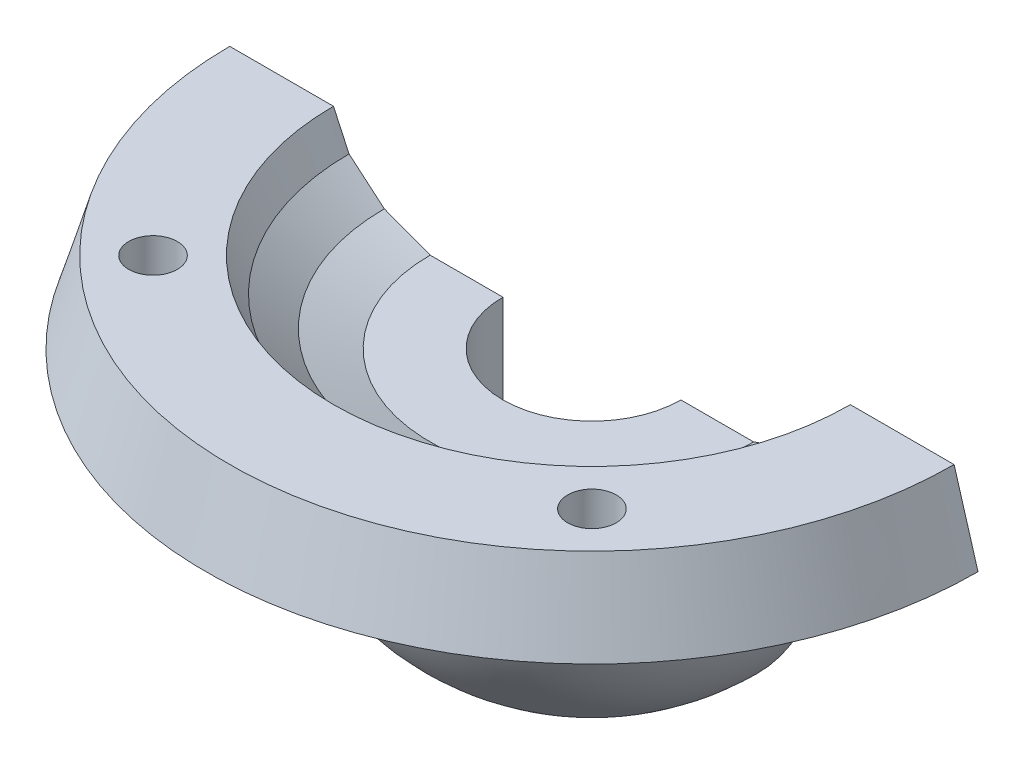
ISO-10303-21;
HEADER;
FILE_DESCRIPTION(('STEP AP214'),'2;1');
FILE_NAME('part.step','',(''),(''),'','','');
FILE_SCHEMA(('AUTOMOTIVE_DESIGN { 1 0 10303 214 1 1 1 1 }'));
ENDSEC;
DATA;
#1=APPLICATION_CONTEXT('core data for automotive mechanical design processes');
#2=APPLICATION_PROTOCOL_DEFINITION('international standard','automotive_design',2000,#1);
#3=PRODUCT_CONTEXT('',#1,'mechanical');
#4=PRODUCT('Part','Part','',(#3));
#5=PRODUCT_RELATED_PRODUCT_CATEGORY('part','',(#4));
#6=PRODUCT_DEFINITION_FORMATION('','',#4);
#7=PRODUCT_DEFINITION_CONTEXT('part definition',#1,'design');
#8=PRODUCT_DEFINITION('design','',#6,#7);
#9=PRODUCT_DEFINITION_SHAPE('','',#8);
#10=(LENGTH_UNIT() NAMED_UNIT(*) SI_UNIT(.MILLI.,.METRE.));
#11=(NAMED_UNIT(*) PLANE_ANGLE_UNIT() SI_UNIT($,.RADIAN.));
#12=(NAMED_UNIT(*) SI_UNIT($,.STERADIAN.) SOLID_ANGLE_UNIT());
#13=UNCERTAINTY_MEASURE_WITH_UNIT(LENGTH_MEASURE(1.E-05),#10,'distance_accuracy_value','');
#14=(GEOMETRIC_REPRESENTATION_CONTEXT(3) GLOBAL_UNCERTAINTY_ASSIGNED_CONTEXT((#13)) GLOBAL_UNIT_ASSIGNED_CONTEXT((#10,
#11,#12)) REPRESENTATION_CONTEXT('',''));
#15=CARTESIAN_POINT('',(0.,0.,0.));
#16=DIRECTION('',(0.,0.,1.));
#17=DIRECTION('',(1.,0.,0.));
#18=AXIS2_PLACEMENT_3D('',#15,#16,#17);
#19=CARTESIAN_POINT('',(0.,-9.5,0.));
#20=DIRECTION('',(0.,1.,0.));
#21=DIRECTION('',(0.,0.,1.));
#22=AXIS2_PLACEMENT_3D('',#19,#20,#21);
#23=PLANE('',#22);
#24=CARTESIAN_POINT('',(0.,-9.5,0.));
#25=DIRECTION('',(0.,-1.,0.));
#26=DIRECTION('',(0.,0.,-1.));
#27=AXIS2_PLACEMENT_3D('',#24,#25,#26);
#28=CIRCLE('',#27,5.99955163034436);
#29=CARTESIAN_POINT('',(5.99955163034436,-9.5,0.));
#30=VERTEX_POINT('',#29);
#31=CARTESIAN_POINT('',(-5.99955163034436,-9.5,0.));
#32=VERTEX_POINT('',#31);
#33=EDGE_CURVE('E11',#30,#32,#28,.T.);
#34=ORIENTED_EDGE('',*,*,#33,.F.);
#35=DIRECTION('',(-1.,0.,0.));
#36=VECTOR('',#35,1.);
#37=CARTESIAN_POINT('',(0.,-9.5,0.));
#38=LINE('',#37,#36);
#39=EDGE_CURVE('E139',#30,#32,#38,.T.);
#40=ORIENTED_EDGE('',*,*,#39,.T.);
#41=EDGE_LOOP('',(#34,#40));
#42=FACE_BOUND('',#41,.T.);
#43=ADVANCED_FACE('F38',(#42),#23,.T.);
#44=CARTESIAN_POINT('',(5.99955163034436,-9.5,0.));
#45=CARTESIAN_POINT('',(6.61396605099555,-9.50002295809842,0.));
#46=CARTESIAN_POINT('',(7.20055343449259,-9.40775932660933,0.));
#47=CARTESIAN_POINT('',(7.83449094822805,-9.30804804948347,0.));
#48=CARTESIAN_POINT('',(8.37066915625013,-9.11079463772736,0.));
#49=CARTESIAN_POINT('',(9.01466001508749,-8.87387826898122,0.));
#50=CARTESIAN_POINT('',(9.42752153762116,-8.53074359866554,0.));
#51=CARTESIAN_POINT('',(9.68430444976027,-8.3173279251515,0.));
#52=CARTESIAN_POINT('',(9.82887241044762,-8.07811753332886,0.));
#53=CARTESIAN_POINT('',(9.99961531347533,-7.79559658926905,0.));
#54=CARTESIAN_POINT('',(9.99962635868416,-7.49999999999999,0.));
#55=B_SPLINE_CURVE_WITH_KNOTS('',2,(#44,#45,#46,#47,#48,#49,#50,#51,#52,#53,#54),.UNSPECIFIED.,
.F.,.F.,(3,2,2,2,2,3),(0.,0.25,0.5,0.75,0.875,1.),.UNSPECIFIED.);
#56=CARTESIAN_POINT('',(0.,-9.5,0.));
#57=DIRECTION('',(0.,-1.,0.));
#58=AXIS1_PLACEMENT('',#56,#57);
#59=SURFACE_OF_REVOLUTION('',#55,#58);
#60=CARTESIAN_POINT('',(0.,-7.5,0.));
#61=DIRECTION('',(0.,-1.,0.));
#62=DIRECTION('',(0.,0.,-1.));
#63=AXIS2_PLACEMENT_3D('',#60,#61,#62);
#64=CIRCLE('',#63,9.99962635868417);
#65=CARTESIAN_POINT('',(9.99962635868417,-7.5,0.));
#66=VERTEX_POINT('',#65);
#67=CARTESIAN_POINT('',(-9.99962635868417,-7.5,0.));
#68=VERTEX_POINT('',#67);
#69=EDGE_CURVE('E49',#66,#68,#64,.T.);
#70=ORIENTED_EDGE('',*,*,#69,.F.);
#71=CARTESIAN_POINT('',(9.99962635868416,-7.49999999999999,0.));
#72=CARTESIAN_POINT('',(9.99962839050835,-7.51967387465813,0.));
#73=CARTESIAN_POINT('',(9.99905777349451,-7.53934778284173,0.));
#74=CARTESIAN_POINT('',(9.99677710958206,-7.57860832192264,0.));
#75=CARTESIAN_POINT('',(9.99506828266646,-7.59819502368751,0.));
#76=CARTESIAN_POINT('',(9.99051181509322,-7.63728110116592,0.));
#77=CARTESIAN_POINT('',(9.98766156375719,-7.65678017234582,0.));
#78=CARTESIAN_POINT('',(9.98082695912954,-7.69569146269355,0.));
#79=CARTESIAN_POINT('',(9.97683630456648,-7.71510257298257,0.));
#80=CARTESIAN_POINT('',(9.96772430714554,-7.75383882368231,0.));
#81=CARTESIAN_POINT('',(9.96259324775312,-7.77316167380568,0.));
#82=CARTESIAN_POINT('',(9.95120382012979,-7.81172265635202,0.));
#83=CARTESIAN_POINT('',(9.94493271640675,-7.83095701874439,0.));
#84=CARTESIAN_POINT('',(9.93126607344495,-7.86934255327232,0.));
#85=CARTESIAN_POINT('',(9.92385525348008,-7.88848827226366,0.));
#86=CARTESIAN_POINT('',(9.90791154012645,-7.9266982341717,0.));
#87=CARTESIAN_POINT('',(9.89936133740584,-7.94575523776493,0.));
#88=CARTESIAN_POINT('',(9.8811408038842,-7.98378953304012,0.));
#89=CARTESIAN_POINT('',(9.87145166070957,-8.00275779040611,0.));
#90=CARTESIAN_POINT('',(9.85095420849574,-8.04061644996868,0.));
#91=CARTESIAN_POINT('',(9.84012607419447,-8.05949609867161,0.));
#92=CARTESIAN_POINT('',(9.8191701233145,-8.09417190548175,0.));
#93=CARTESIAN_POINT('',(9.80915154287965,-8.11003434879421,0.));
#94=CARTESIAN_POINT('',(9.7883745839193,-8.14159257946196,0.));
#95=CARTESIAN_POINT('',(9.77760768781593,-8.15728275746822,0.));
#96=CARTESIAN_POINT('',(9.7553344973771,-8.18849678705557,0.));
#97=CARTESIAN_POINT('',(9.7438193372094,-8.20401430402267,0.));
#98=CARTESIAN_POINT('',(9.72004993594701,-8.23488382602855,0.));
#99=CARTESIAN_POINT('',(9.70778661017508,-8.25022882841588,0.));
#100=CARTESIAN_POINT('',(9.68252103275914,-8.28075393753729,0.));
#101=CARTESIAN_POINT('',(9.66950959309667,-8.29592643088103,0.));
#102=CARTESIAN_POINT('',(9.64274792522381,-8.32610712671582,0.));
#103=CARTESIAN_POINT('',(9.62898850959343,-8.3411071726134,0.));
#104=CARTESIAN_POINT('',(9.60073058007547,-8.37094345921676,0.));
#105=CARTESIAN_POINT('',(9.58622296053328,-8.38577106981389,0.));
#106=CARTESIAN_POINT('',(9.55646956765986,-8.41526306066591,0.));
#107=CARTESIAN_POINT('',(9.54121487005573,-8.42991841243425,0.));
#108=CARTESIAN_POINT('',(9.49385555378069,-8.47408864154925,0.));
#109=CARTESIAN_POINT('',(9.46105516417141,-8.5028617388254,0.));
#110=CARTESIAN_POINT('',(9.39971072450335,-8.55386716963479,0.));
#111=CARTESIAN_POINT('',(9.37139558619255,-8.57637774163087,0.));
#112=CARTESIAN_POINT('',(9.31324763249988,-8.620721425521,0.));
#113=CARTESIAN_POINT('',(9.28339513281944,-8.64252873860582,0.));
#114=CARTESIAN_POINT('',(9.22216832012768,-8.68545959524664,0.));
#115=CARTESIAN_POINT('',(9.19077477826441,-8.70655565270858,0.));
#116=CARTESIAN_POINT('',(9.12646628712565,-8.74806760895407,0.));
#117=CARTESIAN_POINT('',(9.0935329058413,-8.76845490571997,0.));
#118=CARTESIAN_POINT('',(9.02614358273149,-8.80854981021715,0.));
#119=CARTESIAN_POINT('',(8.99167014143273,-8.82822795214073,0.));
#120=CARTESIAN_POINT('',(8.92119982965636,-8.86690537929476,0.));
#121=CARTESIAN_POINT('',(8.88518651592739,-8.88587464576851,0.));
#122=CARTESIAN_POINT('',(8.81163514638845,-8.92313510119812,0.));
#123=CARTESIAN_POINT('',(8.77408176092831,-8.94139598818061,0.));
#124=CARTESIAN_POINT('',(8.69744986528187,-8.97723853643118,0.));
#125=CARTESIAN_POINT('',(8.65835719329048,-8.99478979948911,0.));
#126=CARTESIAN_POINT('',(8.53719948708111,-9.04711770758199,0.));
#127=CARTESIAN_POINT('',(8.45432215869959,-9.0800258898987,0.));
#128=CARTESIAN_POINT('',(8.29842396820683,-9.1373674313827,0.));
#129=CARTESIAN_POINT('',(8.22560023927556,-9.16234451573224,0.));
#130=CARTESIAN_POINT('',(8.07736478596114,-9.20975908515846,0.));
#131=CARTESIAN_POINT('',(8.00193134806801,-9.23212875422472,0.));
#132=CARTESIAN_POINT('',(7.84848066679162,-9.27433609465649,0.));
#133=CARTESIAN_POINT('',(7.77044406297329,-9.29410305147519,0.));
#134=CARTESIAN_POINT('',(7.61178299620726,-9.33110646527565,0.));
#135=CARTESIAN_POINT('',(7.53114160853117,-9.34827010753031,0.));
#136=CARTESIAN_POINT('',(7.36726886028062,-9.38006922907913,0.));
#137=CARTESIAN_POINT('',(7.28402319727737,-9.39463066911813,0.));
#138=CARTESIAN_POINT('',(7.12215455575627,-9.42009040306485,0.));
#139=CARTESIAN_POINT('',(7.04355797879159,-9.4311574953728,0.));
#140=CARTESIAN_POINT('',(6.88562420015101,-9.45084255963852,0.));
#141=CARTESIAN_POINT('',(6.80628529573276,-9.45944687413717,0.));
#142=CARTESIAN_POINT('',(6.64686735412966,-9.47420908433083,0.));
#143=CARTESIAN_POINT('',(6.56678683416007,-9.48035093037252,0.));
#144=CARTESIAN_POINT('',(6.40588553747974,-9.49019013055033,0.));
#145=CARTESIAN_POINT('',(6.32506364692423,-9.49386918069787,0.));
#146=CARTESIAN_POINT('',(6.16267810605128,-9.49878645275539,0.));
#147=CARTESIAN_POINT('',(6.08111383563242,-9.50000429386834,0.));
#148=CARTESIAN_POINT('',(5.99955163034436,-9.5,0.));
#149=B_SPLINE_CURVE_WITH_KNOTS('',3,(#71,#72,#73,#74,#75,#76,#77,#78,#79,#80,#81,#82,#83,#84,
#85,#86,#87,#88,#89,#90,#91,#92,#93,#94,#95,#96,#97,#98,#99,#100,#101,#102,#103,#104,#105,#106,
#107,#108,#109,#110,#111,#112,#113,#114,#115,#116,#117,#118,#119,#120,#121,#122,#123,#124,#125,
#126,#127,#128,#129,#130,#131,#132,#133,#134,#135,#136,#137,#138,#139,#140,#141,#142,#143,#144,
#145,#146,#147,#148),.UNSPECIFIED.,.F.,.F.,(4,2,2,2,2,2,2,2,2,2,2,2,2,2,2,2,2,2,2,2,2,2,2,2,2,2,
2,2,2,2,2,2,2,2,2,2,2,2,4),(0.,0.0590133278245486,0.117963504159202,0.177049289172716,
0.236468082186857,0.296413992870312,0.3570760710073,0.418636768793669,0.481270685897812,
0.545143621508214,0.610411933168543,0.666682665497858,0.723756476858823,0.781713794083774,
0.84063142596777,0.900582490378502,0.961636392394664,1.0238588467747,1.08731193777121,
1.21812741840169,1.32661806671489,1.43749548133101,1.55093773029778,1.66711108829124,
1.78617038798035,1.90825948272514,2.03351178708274,2.16205086641789,2.42941266112328,
2.6603141538193,2.89628633353615,3.13772856917416,3.38501372840924,3.6384888950123,
3.87656515384176,4.11593717100725,4.3568449272456,4.59952384734369,4.84420424364552),.UNSPECIFIED.);
#150=EDGE_CURVE('E144',#30,#66,#149,.F.);
#151=ORIENTED_EDGE('',*,*,#150,.F.);
#152=ORIENTED_EDGE('',*,*,#33,.T.);
#153=CARTESIAN_POINT('',(-5.99955163034436,-9.5,0.));
#154=CARTESIAN_POINT('',(-6.08111383563242,-9.50000429386834,0.));
#155=CARTESIAN_POINT('',(-6.16267810605128,-9.49878645275539,0.));
#156=CARTESIAN_POINT('',(-6.32506364692423,-9.49386918069787,0.));
#157=CARTESIAN_POINT('',(-6.40588553747974,-9.49019013055032,0.));
#158=CARTESIAN_POINT('',(-6.56678683416007,-9.48035093037252,0.));
#159=CARTESIAN_POINT('',(-6.64686735412966,-9.47420908433083,0.));
#160=CARTESIAN_POINT('',(-6.80628529573276,-9.45944687413717,0.));
#161=CARTESIAN_POINT('',(-6.88562420015101,-9.45084255963852,0.));
#162=CARTESIAN_POINT('',(-7.04355797879159,-9.4311574953728,0.));
#163=CARTESIAN_POINT('',(-7.12215455575627,-9.42009040306485,0.));
#164=CARTESIAN_POINT('',(-7.28402319727737,-9.39463066911813,0.));
#165=CARTESIAN_POINT('',(-7.36726886028062,-9.38006922907913,0.));
#166=CARTESIAN_POINT('',(-7.53114160853117,-9.34827010753031,0.));
#167=CARTESIAN_POINT('',(-7.61178299620726,-9.33110646527565,0.));
#168=CARTESIAN_POINT('',(-7.77044406297329,-9.29410305147519,0.));
#169=CARTESIAN_POINT('',(-7.84848066679162,-9.27433609465649,0.));
#170=CARTESIAN_POINT('',(-8.00193134806801,-9.23212875422472,0.));
#171=CARTESIAN_POINT('',(-8.07736478596114,-9.20975908515846,0.));
#172=CARTESIAN_POINT('',(-8.22560023927556,-9.16234451573224,0.));
#173=CARTESIAN_POINT('',(-8.29842396820683,-9.1373674313827,0.));
#174=CARTESIAN_POINT('',(-8.45432215869959,-9.0800258898987,0.));
#175=CARTESIAN_POINT('',(-8.53719948708111,-9.04711770758199,0.));
#176=CARTESIAN_POINT('',(-8.65835719329048,-8.99478979948911,0.));
#177=CARTESIAN_POINT('',(-8.69744986528187,-8.97723853643118,0.));
#178=CARTESIAN_POINT('',(-8.77408176092831,-8.94139598818061,0.));
#179=CARTESIAN_POINT('',(-8.81163514638845,-8.92313510119812,0.));
#180=CARTESIAN_POINT('',(-8.88518651592739,-8.88587464576851,0.));
#181=CARTESIAN_POINT('',(-8.92119982965636,-8.86690537929476,0.));
#182=CARTESIAN_POINT('',(-8.99167014143273,-8.82822795214073,0.));
#183=CARTESIAN_POINT('',(-9.02614358273149,-8.80854981021715,0.));
#184=CARTESIAN_POINT('',(-9.0935329058413,-8.76845490571997,0.));
#185=CARTESIAN_POINT('',(-9.12646628712565,-8.74806760895407,0.));
#186=CARTESIAN_POINT('',(-9.19077477826441,-8.70655565270858,0.));
#187=CARTESIAN_POINT('',(-9.22216832012768,-8.68545959524664,0.));
#188=CARTESIAN_POINT('',(-9.28339513281944,-8.64252873860582,0.));
#189=CARTESIAN_POINT('',(-9.31324763249988,-8.620721425521,0.));
#190=CARTESIAN_POINT('',(-9.37139558619255,-8.57637774163087,0.));
#191=CARTESIAN_POINT('',(-9.39971072450335,-8.55386716963479,0.));
#192=CARTESIAN_POINT('',(-9.46105516417141,-8.5028617388254,0.));
#193=CARTESIAN_POINT('',(-9.49385555378069,-8.47408864154925,0.));
#194=CARTESIAN_POINT('',(-9.54121487005573,-8.42991841243425,0.));
#195=CARTESIAN_POINT('',(-9.55646956765986,-8.41526306066591,0.));
#196=CARTESIAN_POINT('',(-9.58622296053328,-8.38577106981389,0.));
#197=CARTESIAN_POINT('',(-9.60073058007547,-8.37094345921676,0.));
#198=CARTESIAN_POINT('',(-9.62898850959343,-8.3411071726134,0.));
#199=CARTESIAN_POINT('',(-9.64274792522381,-8.32610712671582,0.));
#200=CARTESIAN_POINT('',(-9.66950959309667,-8.29592643088103,0.));
#201=CARTESIAN_POINT('',(-9.68252103275914,-8.28075393753729,0.));
#202=CARTESIAN_POINT('',(-9.70778661017508,-8.25022882841588,0.));
#203=CARTESIAN_POINT('',(-9.72004993594701,-8.23488382602855,0.));
#204=CARTESIAN_POINT('',(-9.7438193372094,-8.20401430402267,0.));
#205=CARTESIAN_POINT('',(-9.7553344973771,-8.18849678705557,0.));
#206=CARTESIAN_POINT('',(-9.77760768781593,-8.15728275746822,0.));
#207=CARTESIAN_POINT('',(-9.7883745839193,-8.14159257946196,0.));
#208=CARTESIAN_POINT('',(-9.80915154287965,-8.11003434879421,0.));
#209=CARTESIAN_POINT('',(-9.8191701233145,-8.09417190548175,0.));
#210=CARTESIAN_POINT('',(-9.84012607419447,-8.05949609867161,0.));
#211=CARTESIAN_POINT('',(-9.85095420849574,-8.04061644996868,0.));
#212=CARTESIAN_POINT('',(-9.87145166070957,-8.00275779040611,0.));
#213=CARTESIAN_POINT('',(-9.8811408038842,-7.98378953304012,0.));
#214=CARTESIAN_POINT('',(-9.89936133740584,-7.94575523776493,0.));
#215=CARTESIAN_POINT('',(-9.90791154012645,-7.92669823417169,0.));
#216=CARTESIAN_POINT('',(-9.92385525348008,-7.88848827226366,0.));
#217=CARTESIAN_POINT('',(-9.93126607344495,-7.86934255327231,0.));
#218=CARTESIAN_POINT('',(-9.94493271640675,-7.83095701874439,0.));
#219=CARTESIAN_POINT('',(-9.95120382012979,-7.81172265635202,0.));
#220=CARTESIAN_POINT('',(-9.96259324775312,-7.77316167380568,0.));
#221=CARTESIAN_POINT('',(-9.96772430714554,-7.75383882368231,0.));
#222=CARTESIAN_POINT('',(-9.97683630456648,-7.71510257298257,0.));
#223=CARTESIAN_POINT('',(-9.98082695912954,-7.69569146269355,0.));
#224=CARTESIAN_POINT('',(-9.98766156375719,-7.65678017234582,0.));
#225=CARTESIAN_POINT('',(-9.99051181509322,-7.63728110116592,0.));
#226=CARTESIAN_POINT('',(-9.99506828266646,-7.59819502368751,0.));
#227=CARTESIAN_POINT('',(-9.99677710958206,-7.57860832192264,0.));
#228=CARTESIAN_POINT('',(-9.99905777349451,-7.53934778284173,0.));
#229=CARTESIAN_POINT('',(-9.99962839050835,-7.51967387465813,0.));
#230=CARTESIAN_POINT('',(-9.99962635868416,-7.49999999999999,0.));
#231=B_SPLINE_CURVE_WITH_KNOTS('',3,(#153,#154,#155,#156,#157,#158,#159,#160,#161,#162,#163,
#164,#165,#166,#167,#168,#169,#170,#171,#172,#173,#174,#175,#176,#177,#178,#179,#180,#181,#182,
#183,#184,#185,#186,#187,#188,#189,#190,#191,#192,#193,#194,#195,#196,#197,#198,#199,#200,#201,
#202,#203,#204,#205,#206,#207,#208,#209,#210,#211,#212,#213,#214,#215,#216,#217,#218,#219,#220,
#221,#222,#223,#224,#225,#226,#227,#228,#229,#230),.UNSPECIFIED.,.F.,.F.,(4,2,2,2,2,2,2,2,2,2,2,
2,2,2,2,2,2,2,2,2,2,2,2,2,2,2,2,2,2,2,2,2,2,2,2,2,2,2,4),(0.,0.244680396301831,0.48735931639992,
0.728267072638264,0.967639089803761,1.20571534863321,1.45919051523628,1.70647567447136,
1.94791791010937,2.18389008982621,2.41479158252224,2.68215337722762,2.81069245656278,
2.93594476092038,3.05803385566516,3.17709315535428,3.29326651334774,3.40670876231451,
3.51758617693063,3.62607682524383,3.75689230587431,3.82034539687081,3.88256785125085,
3.94362175326702,4.00357281767775,4.06249044956174,4.1204477667867,4.17752157814766,
4.23379231047698,4.29906062213731,4.36293355774771,4.42556747485185,4.48712817263822,
4.54779025077521,4.60773616145866,4.6671549544728,4.72624073948632,4.78519091582097,
4.84420424364552),.UNSPECIFIED.);
#232=EDGE_CURVE('E149',#32,#68,#231,.T.);
#233=ORIENTED_EDGE('',*,*,#232,.T.);
#234=EDGE_LOOP('',(#70,#151,#152,#233));
#235=FACE_BOUND('',#234,.T.);
#236=ADVANCED_FACE('F40',(#235),#59,.T.);
#237=CARTESIAN_POINT('',(0.,-4.20530792283386,0.));
#238=DIRECTION('',(0.,1.,0.));
#239=DIRECTION('',(0.,0.,1.));
#240=AXIS2_PLACEMENT_3D('',#237,#238,#239);
#241=CONICAL_SURFACE('',#240,10.,0.000113407051547982);
#242=CARTESIAN_POINT('',(0.,-4.20530792283386,0.));
#243=DIRECTION('',(0.,-1.,0.));
#244=DIRECTION('',(0.,0.,-1.));
#245=AXIS2_PLACEMENT_3D('',#242,#243,#244);
#246=CIRCLE('',#245,10.);
#247=CARTESIAN_POINT('',(10.,-4.20530792283386,0.));
#248=VERTEX_POINT('',#247);
#249=CARTESIAN_POINT('',(-10.,-4.20530792283386,0.));
#250=VERTEX_POINT('',#249);
#251=EDGE_CURVE('E204',#248,#250,#246,.T.);
#252=ORIENTED_EDGE('',*,*,#251,.F.);
#253=DIRECTION('',(-0.000113407051304891,-0.99999999356942,0.));
#254=VECTOR('',#253,1.);
#255=CARTESIAN_POINT('',(10.0004767829567,-0.00113412459089122,0.));
#256=LINE('',#255,#254);
#257=EDGE_CURVE('E207',#248,#66,#256,.T.);
#258=ORIENTED_EDGE('',*,*,#257,.T.);
#259=ORIENTED_EDGE('',*,*,#69,.T.);
#260=DIRECTION('',(0.000113407051304891,-0.99999999356942,0.));
#261=VECTOR('',#260,1.);
#262=CARTESIAN_POINT('',(-10.0004767829567,-0.00113412459089122,0.));
#263=LINE('',#262,#261);
#264=EDGE_CURVE('E157',#250,#68,#263,.T.);
#265=ORIENTED_EDGE('',*,*,#264,.F.);
#266=EDGE_LOOP('',(#252,#258,#259,#265));
#267=FACE_BOUND('',#266,.T.);
#268=ADVANCED_FACE('F310',(#267),#241,.F.);
#269=CARTESIAN_POINT('',(0.,-3.5,0.));
#270=DIRECTION('',(0.,-1.,0.));
#271=DIRECTION('',(0.,0.,-1.));
#272=AXIS2_PLACEMENT_3D('',#269,#270,#271);
#273=CONICAL_SURFACE('',#272,6.14232061003034,1.38996145466932);
#274=CARTESIAN_POINT('',(0.,-3.5,0.));
#275=DIRECTION('',(0.,-1.,0.));
#276=DIRECTION('',(0.,0.,-1.));
#277=AXIS2_PLACEMENT_3D('',#274,#275,#276);
#278=CIRCLE('',#277,6.14232061003034);
#279=CARTESIAN_POINT('',(6.14232061003034,-3.5,0.));
#280=VERTEX_POINT('',#279);
#281=CARTESIAN_POINT('',(-6.14232061003034,-3.5,0.));
#282=VERTEX_POINT('',#281);
#283=EDGE_CURVE('E304',#280,#282,#278,.T.);
#284=ORIENTED_EDGE('',*,*,#283,.F.);
#285=DIRECTION('',(0.98369388312983,-0.179850894612612,0.));
#286=VECTOR('',#285,1.);
#287=CARTESIAN_POINT('',(-0.420532169960723,-2.30009933584544,0.));
#288=LINE('',#287,#286);
#289=EDGE_CURVE('E210',#280,#248,#288,.T.);
#290=ORIENTED_EDGE('',*,*,#289,.T.);
#291=ORIENTED_EDGE('',*,*,#251,.T.);
#292=DIRECTION('',(-0.98369388312983,-0.179850894612612,0.));
#293=VECTOR('',#292,1.);
#294=CARTESIAN_POINT('',(0.420532169960723,-2.30009933584544,0.));
#295=LINE('',#294,#293);
#296=EDGE_CURVE('E220',#282,#250,#295,.T.);
#297=ORIENTED_EDGE('',*,*,#296,.F.);
#298=EDGE_LOOP('',(#284,#290,#291,#297));
#299=FACE_BOUND('',#298,.T.);
#300=ADVANCED_FACE('F306',(#299),#273,.F.);
#301=CARTESIAN_POINT('',(0.,-3.5,0.));
#302=DIRECTION('',(0.,-1.,0.));
#303=DIRECTION('',(0.,0.,-1.));
#304=AXIS2_PLACEMENT_3D('',#301,#302,#303);
#305=PLANE('',#304);
#306=CARTESIAN_POINT('',(0.,-3.5,0.));
#307=DIRECTION('',(0.,-1.,0.));
#308=DIRECTION('',(0.,0.,-1.));
#309=AXIS2_PLACEMENT_3D('',#306,#307,#308);
#310=CIRCLE('',#309,5.5);
#311=CARTESIAN_POINT('',(5.5,-3.5,0.));
#312=VERTEX_POINT('',#311);
#313=CARTESIAN_POINT('',(-5.5,-3.5,0.));
#314=VERTEX_POINT('',#313);
#315=EDGE_CURVE('E302',#312,#314,#310,.T.);
#316=ORIENTED_EDGE('',*,*,#315,.F.);
#317=DIRECTION('',(1.,0.,0.));
#318=VECTOR('',#317,1.);
#319=CARTESIAN_POINT('',(0.,-3.5,0.));
#320=LINE('',#319,#318);
#321=EDGE_CURVE('E261',#312,#280,#320,.T.);
#322=ORIENTED_EDGE('',*,*,#321,.T.);
#323=ORIENTED_EDGE('',*,*,#283,.T.);
#324=DIRECTION('',(-1.,0.,0.));
#325=VECTOR('',#324,1.);
#326=CARTESIAN_POINT('',(0.,-3.5,0.));
#327=LINE('',#326,#325);
#328=EDGE_CURVE('E221',#314,#282,#327,.T.);
#329=ORIENTED_EDGE('',*,*,#328,.F.);
#330=EDGE_LOOP('',(#316,#322,#323,#329));
#331=FACE_BOUND('',#330,.T.);
#332=ADVANCED_FACE('F314',(#331),#305,.T.);
#333=CARTESIAN_POINT('',(0.,-9.5,0.));
#334=DIRECTION('',(0.,-1.,0.));
#335=DIRECTION('',(0.,0.,-1.));
#336=AXIS2_PLACEMENT_3D('',#333,#334,#335);
#337=CYLINDRICAL_SURFACE('',#336,5.5);
#338=CARTESIAN_POINT('',(0.,2.,0.));
#339=DIRECTION('',(0.,-1.,0.));
#340=DIRECTION('',(0.,0.,-1.));
#341=AXIS2_PLACEMENT_3D('',#338,#339,#340);
#342=CIRCLE('',#341,5.5);
#343=CARTESIAN_POINT('',(5.5,2.,0.));
#344=VERTEX_POINT('',#343);
#345=CARTESIAN_POINT('',(-5.5,2.,0.));
#346=VERTEX_POINT('',#345);
#347=EDGE_CURVE('E300',#344,#346,#342,.T.);
#348=ORIENTED_EDGE('',*,*,#347,.F.);
#349=DIRECTION('',(0.,-1.,0.));
#350=VECTOR('',#349,1.);
#351=CARTESIAN_POINT('',(5.5,0.,0.));
#352=LINE('',#351,#350);
#353=EDGE_CURVE('E264',#344,#312,#352,.T.);
#354=ORIENTED_EDGE('',*,*,#353,.T.);
#355=ORIENTED_EDGE('',*,*,#315,.T.);
#356=DIRECTION('',(0.,-1.,0.));
#357=VECTOR('',#356,1.);
#358=CARTESIAN_POINT('',(-5.5,0.,0.));
#359=LINE('',#358,#357);
#360=EDGE_CURVE('E225',#346,#314,#359,.T.);
#361=ORIENTED_EDGE('',*,*,#360,.F.);
#362=EDGE_LOOP('',(#348,#354,#355,#361));
#363=FACE_BOUND('',#362,.T.);
#364=ADVANCED_FACE('F318',(#363),#337,.F.);
#365=CARTESIAN_POINT('',(0.,2.,0.));
#366=DIRECTION('',(0.,-1.,0.));
#367=DIRECTION('',(0.,0.,-1.));
#368=AXIS2_PLACEMENT_3D('',#365,#366,#367);
#369=PLANE('',#368);
#370=CARTESIAN_POINT('',(0.,2.,0.));
#371=DIRECTION('',(0.,-1.,0.));
#372=DIRECTION('',(0.,0.,-1.));
#373=AXIS2_PLACEMENT_3D('',#370,#371,#372);
#374=CIRCLE('',#373,10.);
#375=CARTESIAN_POINT('',(10.,2.,0.));
#376=VERTEX_POINT('',#375);
#377=CARTESIAN_POINT('',(-10.,2.,0.));
#378=VERTEX_POINT('',#377);
#379=EDGE_CURVE('E298',#376,#378,#374,.T.);
#380=ORIENTED_EDGE('',*,*,#379,.F.);
#381=DIRECTION('',(1.,0.,0.));
#382=VECTOR('',#381,1.);
#383=CARTESIAN_POINT('',(0.,2.,0.));
#384=LINE('',#383,#382);
#385=EDGE_CURVE('E267',#344,#376,#384,.T.);
#386=ORIENTED_EDGE('',*,*,#385,.F.);
#387=ORIENTED_EDGE('',*,*,#347,.T.);
#388=DIRECTION('',(-1.,0.,0.));
#389=VECTOR('',#388,1.);
#390=CARTESIAN_POINT('',(0.,2.,0.));
#391=LINE('',#390,#389);
#392=EDGE_CURVE('E233',#346,#378,#391,.T.);
#393=ORIENTED_EDGE('',*,*,#392,.T.);
#394=EDGE_LOOP('',(#380,#386,#387,#393));
#395=FACE_BOUND('',#394,.T.);
#396=ADVANCED_FACE('F323',(#395),#369,.F.);
#397=CARTESIAN_POINT('',(0.,3.06472146190274,0.));
#398=DIRECTION('',(0.,1.,0.));
#399=DIRECTION('',(0.,0.,1.));
#400=AXIS2_PLACEMENT_3D('',#397,#398,#399);
#401=CONICAL_SURFACE('',#400,12.8318599551805,1.21116714027881);
#402=CARTESIAN_POINT('',(0.,3.06472146190274,0.));
#403=DIRECTION('',(0.,-1.,0.));
#404=DIRECTION('',(0.,0.,-1.));
#405=AXIS2_PLACEMENT_3D('',#402,#403,#404);
#406=CIRCLE('',#405,12.8318599551805);
#407=CARTESIAN_POINT('',(12.8318599551805,3.06472146190274,0.));
#408=VERTEX_POINT('',#407);
#409=CARTESIAN_POINT('',(-12.8318599551805,3.06472146190274,0.));
#410=VERTEX_POINT('',#409);
#411=EDGE_CURVE('E296',#408,#410,#406,.T.);
#412=ORIENTED_EDGE('',*,*,#411,.F.);
#413=DIRECTION('',(-0.936027387366533,-0.351927165901955,0.));
#414=VECTOR('',#413,1.);
#415=CARTESIAN_POINT('',(0.579700369712789,-1.54184011662471,0.));
#416=LINE('',#415,#414);
#417=EDGE_CURVE('E270',#408,#376,#416,.T.);
#418=ORIENTED_EDGE('',*,*,#417,.T.);
#419=ORIENTED_EDGE('',*,*,#379,.T.);
#420=DIRECTION('',(0.936027387366533,-0.351927165901955,0.));
#421=VECTOR('',#420,1.);
#422=CARTESIAN_POINT('',(-0.579700369712789,-1.54184011662471,0.));
#423=LINE('',#422,#421);
#424=EDGE_CURVE('E236',#410,#378,#423,.T.);
#425=ORIENTED_EDGE('',*,*,#424,.F.);
#426=EDGE_LOOP('',(#412,#418,#419,#425));
#427=FACE_BOUND('',#426,.T.);
#428=ADVANCED_FACE('F326',(#427),#401,.F.);
#429=CARTESIAN_POINT('',(0.,4.91321714357226,0.));
#430=DIRECTION('',(0.,1.,0.));
#431=DIRECTION('',(0.,0.,1.));
#432=AXIS2_PLACEMENT_3D('',#429,#430,#431);
#433=CONICAL_SURFACE('',#432,15.0130848595505,0.867780093989139);
#434=CARTESIAN_POINT('',(0.,4.91321714357226,0.));
#435=DIRECTION('',(0.,-1.,0.));
#436=DIRECTION('',(0.,0.,-1.));
#437=AXIS2_PLACEMENT_3D('',#434,#435,#436);
#438=CIRCLE('',#437,15.0130848595505);
#439=CARTESIAN_POINT('',(15.0130848595505,4.91321714357226,-1.04835811251178E-13));
#440=VERTEX_POINT('',#439);
#441=CARTESIAN_POINT('',(-15.0130848595505,4.91321714357226,0.));
#442=VERTEX_POINT('',#441);
#443=EDGE_CURVE('E294',#440,#442,#438,.T.);
#444=ORIENTED_EDGE('',*,*,#443,.F.);
#445=DIRECTION('',(-0.762895600573906,-0.646521695401615,0.));
#446=VECTOR('',#445,1.);
#447=CARTESIAN_POINT('',(3.85198488134727,-4.54534215998979,0.));
#448=LINE('',#447,#446);
#449=EDGE_CURVE('E273',#440,#408,#448,.T.);
#450=ORIENTED_EDGE('',*,*,#449,.T.);
#451=ORIENTED_EDGE('',*,*,#411,.T.);
#452=DIRECTION('',(0.762895600573906,-0.646521695401615,0.));
#453=VECTOR('',#452,1.);
#454=CARTESIAN_POINT('',(-3.85198488134727,-4.54534215998979,0.));
#455=LINE('',#454,#453);
#456=EDGE_CURVE('E239',#442,#410,#455,.T.);
#457=ORIENTED_EDGE('',*,*,#456,.F.);
#458=EDGE_LOOP('',(#444,#450,#451,#457));
#459=FACE_BOUND('',#458,.T.);
#460=ADVANCED_FACE('F330',(#459),#433,.F.);
#461=CARTESIAN_POINT('',(0.,6.98353230704211,0.));
#462=DIRECTION('',(0.,1.,0.));
#463=DIRECTION('',(0.,0.,1.));
#464=AXIS2_PLACEMENT_3D('',#461,#462,#463);
#465=CONICAL_SURFACE('',#464,15.9743026140186,0.434670215149244);
#466=CARTESIAN_POINT('',(0.,6.98353230704211,0.));
#467=DIRECTION('',(0.,-1.,0.));
#468=DIRECTION('',(0.,0.,-1.));
#469=AXIS2_PLACEMENT_3D('',#466,#467,#468);
#470=CIRCLE('',#469,15.9743026140186);
#471=CARTESIAN_POINT('',(15.9743026140186,6.98353230704211,-1.11547958955758E-13));
#472=VERTEX_POINT('',#471);
#473=CARTESIAN_POINT('',(-15.9743026140186,6.98353230704211,0.));
#474=VERTEX_POINT('',#473);
#475=EDGE_CURVE('E292',#472,#474,#470,.T.);
#476=ORIENTED_EDGE('',*,*,#475,.F.);
#477=DIRECTION('',(-0.421111306454629,-0.907008967748432,0.));
#478=VECTOR('',#477,1.);
#479=CARTESIAN_POINT('',(10.4741316785176,-4.86298970788318,0.));
#480=LINE('',#479,#478);
#481=EDGE_CURVE('E276',#472,#440,#480,.T.);
#482=ORIENTED_EDGE('',*,*,#481,.T.);
#483=ORIENTED_EDGE('',*,*,#443,.T.);
#484=DIRECTION('',(0.421111306454629,-0.907008967748432,0.));
#485=VECTOR('',#484,1.);
#486=CARTESIAN_POINT('',(-10.4741316785176,-4.86298970788318,0.));
#487=LINE('',#486,#485);
#488=EDGE_CURVE('E242',#474,#442,#487,.T.);
#489=ORIENTED_EDGE('',*,*,#488,.F.);
#490=EDGE_LOOP('',(#476,#482,#483,#489));
#491=FACE_BOUND('',#490,.T.);
#492=ADVANCED_FACE('F334',(#491),#465,.F.);
#493=CARTESIAN_POINT('',(0.,6.98353230704211,0.));
#494=DIRECTION('',(0.,1.,0.));
#495=DIRECTION('',(0.,0.,1.));
#496=AXIS2_PLACEMENT_3D('',#493,#494,#495);
#497=PLANE('',#496);
#498=CARTESIAN_POINT('',(-13.5647015960109,6.98353230704211,13.5647015960109));
#499=DIRECTION('',(0.,-1.,0.));
#500=DIRECTION('',(0.,0.,1.));
#501=AXIS2_PLACEMENT_3D('',#498,#499,#500);
#502=CIRCLE('',#501,1.5);
#503=CARTESIAN_POINT('',(-13.5647015960109,6.98353230704211,15.0647015960109));
#504=VERTEX_POINT('',#503);
#505=EDGE_CURVE('E429',#504,#504,#502,.T.);
#506=ORIENTED_EDGE('',*,*,#505,.T.);
#507=EDGE_LOOP('',(#506));
#508=FACE_BOUND('',#507,.T.);
#509=CARTESIAN_POINT('',(13.5647015960109,6.98353230704211,13.5647015960109));
#510=DIRECTION('',(0.,1.,0.));
#511=DIRECTION('',(0.,0.,1.));
#512=AXIS2_PLACEMENT_3D('',#509,#510,#511);
#513=CIRCLE('',#512,1.5);
#514=CARTESIAN_POINT('',(13.5647015960109,6.98353230704211,15.0647015960109));
#515=VERTEX_POINT('',#514);
#516=EDGE_CURVE('E228',#515,#515,#513,.T.);
#517=ORIENTED_EDGE('',*,*,#516,.F.);
#518=EDGE_LOOP('',(#517));
#519=FACE_BOUND('',#518,.T.);
#520=CARTESIAN_POINT('',(0.,6.98353230704211,0.));
#521=DIRECTION('',(0.,-1.,0.));
#522=DIRECTION('',(0.,0.,-1.));
#523=AXIS2_PLACEMENT_3D('',#520,#521,#522);
#524=CIRCLE('',#523,22.3878916266319);
#525=CARTESIAN_POINT('',(22.3878916266319,6.98353230704211,-1.56333811660856E-13));
#526=VERTEX_POINT('',#525);
#527=CARTESIAN_POINT('',(-22.3878916266319,6.98353230704211,0.));
#528=VERTEX_POINT('',#527);
#529=EDGE_CURVE('E290',#526,#528,#524,.T.);
#530=ORIENTED_EDGE('',*,*,#529,.F.);
#531=DIRECTION('',(-1.,0.,0.));
#532=VECTOR('',#531,1.);
#533=CARTESIAN_POINT('',(0.,6.98353230704211,0.));
#534=LINE('',#533,#532);
#535=EDGE_CURVE('E279',#526,#472,#534,.T.);
#536=ORIENTED_EDGE('',*,*,#535,.T.);
#537=ORIENTED_EDGE('',*,*,#475,.T.);
#538=DIRECTION('',(1.,0.,0.));
#539=VECTOR('',#538,1.);
#540=CARTESIAN_POINT('',(0.,6.98353230704211,0.));
#541=LINE('',#540,#539);
#542=EDGE_CURVE('E245',#528,#474,#541,.T.);
#543=ORIENTED_EDGE('',*,*,#542,.F.);
#544=EDGE_LOOP('',(#530,#536,#537,#543));
#545=FACE_BOUND('',#544,.T.);
#546=ADVANCED_FACE('F337',(#508,#519,#545),#497,.T.);
#547=CARTESIAN_POINT('',(0.,1.98353230704211,0.));
#548=DIRECTION('',(0.,-1.,0.));
#549=DIRECTION('',(0.,0.,-1.));
#550=AXIS2_PLACEMENT_3D('',#547,#548,#549);
#551=CONICAL_SURFACE('',#550,23.8636903192362,0.287010293332889);
#552=CARTESIAN_POINT('',(0.,1.98353230704211,0.));
#553=DIRECTION('',(0.,-1.,0.));
#554=DIRECTION('',(0.,0.,-1.));
#555=AXIS2_PLACEMENT_3D('',#552,#553,#554);
#556=CIRCLE('',#555,23.8636903192362);
#557=CARTESIAN_POINT('',(23.8636903192362,1.98353230704211,-1.6663925885109E-13));
#558=VERTEX_POINT('',#557);
#559=CARTESIAN_POINT('',(-23.8636903192362,1.98353230704211,0.));
#560=VERTEX_POINT('',#559);
#561=EDGE_CURVE('E65',#558,#560,#556,.T.);
#562=ORIENTED_EDGE('',*,*,#561,.F.);
#563=DIRECTION('',(-0.283086083300354,0.959094504958539,0.));
#564=VECTOR('',#563,1.);
#565=CARTESIAN_POINT('',(22.4898498656544,6.63809820571989,-1.57045782238632E-13));
#566=LINE('',#565,#564);
#567=EDGE_CURVE('E282',#558,#526,#566,.T.);
#568=ORIENTED_EDGE('',*,*,#567,.T.);
#569=ORIENTED_EDGE('',*,*,#529,.T.);
#570=DIRECTION('',(0.283086083300354,0.959094504958539,0.));
#571=VECTOR('',#570,1.);
#572=CARTESIAN_POINT('',(-22.4898498656544,6.63809820571989,0.));
#573=LINE('',#572,#571);
#574=EDGE_CURVE('E248',#560,#528,#573,.T.);
#575=ORIENTED_EDGE('',*,*,#574,.F.);
#576=EDGE_LOOP('',(#562,#568,#569,#575));
#577=FACE_BOUND('',#576,.T.);
#578=ADVANCED_FACE('F339',(#577),#551,.T.);
#579=CARTESIAN_POINT('',(0.,1.98353230704211,0.));
#580=DIRECTION('',(0.,-1.,0.));
#581=DIRECTION('',(0.,0.,-1.));
#582=AXIS2_PLACEMENT_3D('',#579,#580,#581);
#583=PLANE('',#582);
#584=CARTESIAN_POINT('',(-13.5647015960109,1.98353230704211,13.5647015960109));
#585=DIRECTION('',(0.,-1.,0.));
#586=DIRECTION('',(0.,0.,-1.));
#587=AXIS2_PLACEMENT_3D('',#584,#585,#586);
#588=CIRCLE('',#587,1.5);
#589=CARTESIAN_POINT('',(-13.5647015960109,1.98353230704211,12.0647015960109));
#590=VERTEX_POINT('',#589);
#591=EDGE_CURVE('E44',#590,#590,#588,.F.);
#592=ORIENTED_EDGE('',*,*,#591,.T.);
#593=EDGE_LOOP('',(#592));
#594=FACE_BOUND('',#593,.T.);
#595=CARTESIAN_POINT('',(13.5647015960109,1.98353230704211,13.5647015960109));
#596=DIRECTION('',(0.,-1.,0.));
#597=DIRECTION('',(0.,0.,-1.));
#598=AXIS2_PLACEMENT_3D('',#595,#596,#597);
#599=CIRCLE('',#598,1.5);
#600=CARTESIAN_POINT('',(13.5647015960109,1.98353230704211,12.0647015960109));
#601=VERTEX_POINT('',#600);
#602=EDGE_CURVE('E158',#601,#601,#599,.T.);
#603=ORIENTED_EDGE('',*,*,#602,.F.);
#604=EDGE_LOOP('',(#603));
#605=FACE_BOUND('',#604,.T.);
#606=CARTESIAN_POINT('',(0.,1.98353230704211,0.));
#607=DIRECTION('',(0.,-1.,0.));
#608=DIRECTION('',(0.,0.,-1.));
#609=AXIS2_PLACEMENT_3D('',#606,#607,#608);
#610=CIRCLE('',#609,14.3636903192362);
#611=CARTESIAN_POINT('',(14.3636903192362,1.98353230704211,-1.0030111341307E-13));
#612=VERTEX_POINT('',#611);
#613=CARTESIAN_POINT('',(-14.3636903192362,1.98353230704211,0.));
#614=VERTEX_POINT('',#613);
#615=EDGE_CURVE('E57',#612,#614,#610,.T.);
#616=ORIENTED_EDGE('',*,*,#615,.F.);
#617=DIRECTION('',(1.,0.,0.));
#618=VECTOR('',#617,1.);
#619=CARTESIAN_POINT('',(0.,1.98353230704211,0.));
#620=LINE('',#619,#618);
#621=EDGE_CURVE('E284',#612,#558,#620,.T.);
#622=ORIENTED_EDGE('',*,*,#621,.T.);
#623=ORIENTED_EDGE('',*,*,#561,.T.);
#624=DIRECTION('',(-1.,0.,0.));
#625=VECTOR('',#624,1.);
#626=CARTESIAN_POINT('',(0.,1.98353230704211,0.));
#627=LINE('',#626,#625);
#628=EDGE_CURVE('E145',#614,#560,#627,.T.);
#629=ORIENTED_EDGE('',*,*,#628,.F.);
#630=EDGE_LOOP('',(#616,#622,#623,#629));
#631=FACE_BOUND('',#630,.T.);
#632=ADVANCED_FACE('F341',(#594,#605,#631),#583,.T.);
#633=CARTESIAN_POINT('',(0.,0.,0.));
#634=DIRECTION('',(0.,-1.,0.));
#635=DIRECTION('',(1.,0.,0.));
#636=AXIS2_PLACEMENT_3D('',#633,#634,#635);
#637=SPHERICAL_SURFACE('',#636,14.5);
#638=ORIENTED_EDGE('',*,*,#615,.T.);
#639=CARTESIAN_POINT('',(0.,0.,0.));
#640=DIRECTION('',(0.,0.,-1.));
#641=DIRECTION('',(-1.,0.,0.));
#642=AXIS2_PLACEMENT_3D('',#639,#640,#641);
#643=CIRCLE('',#642,14.5);
#644=EDGE_CURVE('E286',#612,#614,#643,.T.);
#645=ORIENTED_EDGE('',*,*,#644,.F.);
#646=EDGE_LOOP('',(#638,#645));
#647=FACE_BOUND('',#646,.T.);
#648=ADVANCED_FACE('F176',(#647),#637,.T.);
#649=CARTESIAN_POINT('',(0.,0.,0.));
#650=DIRECTION('',(0.,0.,-1.));
#651=DIRECTION('',(-1.,0.,0.));
#652=AXIS2_PLACEMENT_3D('',#649,#650,#651);
#653=PLANE('',#652);
#654=ORIENTED_EDGE('',*,*,#39,.F.);
#655=ORIENTED_EDGE('',*,*,#150,.T.);
#656=ORIENTED_EDGE('',*,*,#257,.F.);
#657=ORIENTED_EDGE('',*,*,#289,.F.);
#658=ORIENTED_EDGE('',*,*,#321,.F.);
#659=ORIENTED_EDGE('',*,*,#353,.F.);
#660=ORIENTED_EDGE('',*,*,#385,.T.);
#661=ORIENTED_EDGE('',*,*,#417,.F.);
#662=ORIENTED_EDGE('',*,*,#449,.F.);
#663=ORIENTED_EDGE('',*,*,#481,.F.);
#664=ORIENTED_EDGE('',*,*,#535,.F.);
#665=ORIENTED_EDGE('',*,*,#567,.F.);
#666=ORIENTED_EDGE('',*,*,#621,.F.);
#667=ORIENTED_EDGE('',*,*,#644,.T.);
#668=ORIENTED_EDGE('',*,*,#628,.T.);
#669=ORIENTED_EDGE('',*,*,#574,.T.);
#670=ORIENTED_EDGE('',*,*,#542,.T.);
#671=ORIENTED_EDGE('',*,*,#488,.T.);
#672=ORIENTED_EDGE('',*,*,#456,.T.);
#673=ORIENTED_EDGE('',*,*,#424,.T.);
#674=ORIENTED_EDGE('',*,*,#392,.F.);
#675=ORIENTED_EDGE('',*,*,#360,.T.);
#676=ORIENTED_EDGE('',*,*,#328,.T.);
#677=ORIENTED_EDGE('',*,*,#296,.T.);
#678=ORIENTED_EDGE('',*,*,#264,.T.);
#679=ORIENTED_EDGE('',*,*,#232,.F.);
#680=EDGE_LOOP('',(#654,#655,#656,#657,#658,#659,#660,#661,#662,#663,#664,#665,#666,#667,#668,
#669,#670,#671,#672,#673,#674,#675,#676,#677,#678,#679));
#681=FACE_BOUND('',#680,.T.);
#682=ADVANCED_FACE('F154',(#681),#653,.T.);
#683=CARTESIAN_POINT('',(13.5647015960109,-3.01646769295789,13.5647015960109));
#684=DIRECTION('',(0.,1.,0.));
#685=DIRECTION('',(0.,0.,1.));
#686=AXIS2_PLACEMENT_3D('',#683,#684,#685);
#687=CYLINDRICAL_SURFACE('',#686,1.5);
#688=ORIENTED_EDGE('',*,*,#602,.T.);
#689=EDGE_LOOP('',(#688));
#690=FACE_BOUND('',#689,.T.);
#691=ORIENTED_EDGE('',*,*,#516,.T.);
#692=EDGE_LOOP('',(#691));
#693=FACE_BOUND('',#692,.T.);
#694=ADVANCED_FACE('F175',(#690,#693),#687,.F.);
#695=CARTESIAN_POINT('',(-13.5647015960109,-3.01646769295789,13.5647015960109));
#696=DIRECTION('',(0.,1.,0.));
#697=DIRECTION('',(0.,0.,1.));
#698=AXIS2_PLACEMENT_3D('',#695,#696,#697);
#699=CYLINDRICAL_SURFACE('',#698,1.5);
#700=ORIENTED_EDGE('',*,*,#591,.F.);
#701=EDGE_LOOP('',(#700));
#702=FACE_BOUND('',#701,.T.);
#703=ORIENTED_EDGE('',*,*,#505,.F.);
#704=EDGE_LOOP('',(#703));
#705=FACE_BOUND('',#704,.T.);
#706=ADVANCED_FACE('F395',(#702,#705),#699,.F.);
#707=CLOSED_SHELL('',(#43,#236,#268,#300,#332,#364,#396,#428,#460,#492,#546,#578,#632,#648,#682,
#694,#706));
#708=MANIFOLD_SOLID_BREP('B2',#707);
#709=ADVANCED_BREP_SHAPE_REPRESENTATION('',(#18,#708),#14);
#710=SHAPE_DEFINITION_REPRESENTATION(#9,#709);
ENDSEC;
END-ISO-10303-21;
